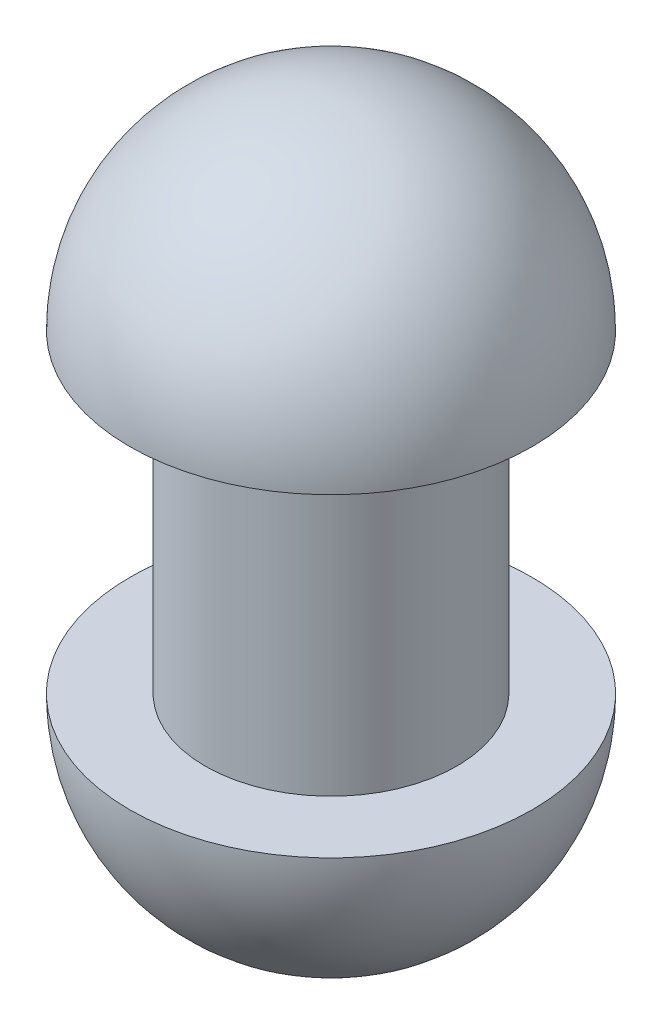
ISO-10303-21;
HEADER;
FILE_DESCRIPTION(('STEP AP214'),'2;1');
FILE_NAME('part.step','',(''),(''),'','','');
FILE_SCHEMA(('AUTOMOTIVE_DESIGN { 1 0 10303 214 1 1 1 1 }'));
ENDSEC;
DATA;
#1=APPLICATION_CONTEXT('core data for automotive mechanical design processes');
#2=APPLICATION_PROTOCOL_DEFINITION('international standard','automotive_design',2000,#1);
#3=PRODUCT_CONTEXT('',#1,'mechanical');
#4=PRODUCT('Part','Part','',(#3));
#5=PRODUCT_RELATED_PRODUCT_CATEGORY('part','',(#4));
#6=PRODUCT_DEFINITION_FORMATION('','',#4);
#7=PRODUCT_DEFINITION_CONTEXT('part definition',#1,'design');
#8=PRODUCT_DEFINITION('design','',#6,#7);
#9=PRODUCT_DEFINITION_SHAPE('','',#8);
#10=(LENGTH_UNIT() NAMED_UNIT(*) SI_UNIT(.MILLI.,.METRE.));
#11=(NAMED_UNIT(*) PLANE_ANGLE_UNIT() SI_UNIT($,.RADIAN.));
#12=(NAMED_UNIT(*) SI_UNIT($,.STERADIAN.) SOLID_ANGLE_UNIT());
#13=UNCERTAINTY_MEASURE_WITH_UNIT(LENGTH_MEASURE(1.E-05),#10,'distance_accuracy_value','');
#14=(GEOMETRIC_REPRESENTATION_CONTEXT(3) GLOBAL_UNCERTAINTY_ASSIGNED_CONTEXT((#13)) GLOBAL_UNIT_ASSIGNED_CONTEXT((#10,
#11,#12)) REPRESENTATION_CONTEXT('',''));
#15=CARTESIAN_POINT('',(0.,0.,0.));
#16=DIRECTION('',(0.,0.,1.));
#17=DIRECTION('',(1.,0.,0.));
#18=AXIS2_PLACEMENT_3D('',#15,#16,#17);
#19=CARTESIAN_POINT('',(8.99999999999999,-6.19109467455622,0.));
#20=DIRECTION('',(0.,1.,0.));
#21=DIRECTION('',(0.,0.,1.));
#22=AXIS2_PLACEMENT_3D('',#19,#20,#21);
#23=PLANE('',#22);
#24=CARTESIAN_POINT('',(0.,-6.19109467455621,0.));
#25=DIRECTION('',(0.,1.,0.));
#26=DIRECTION('',(0.,0.,1.));
#27=AXIS2_PLACEMENT_3D('',#24,#25,#26);
#28=CIRCLE('',#27,14.4);
#29=CARTESIAN_POINT('',(0.,-6.19109467455621,14.4));
#30=VERTEX_POINT('',#29);
#31=EDGE_CURVE('E10',#30,#30,#28,.T.);
#32=ORIENTED_EDGE('',*,*,#31,.F.);
#33=EDGE_LOOP('',(#32));
#34=FACE_BOUND('',#33,.T.);
#35=CARTESIAN_POINT('',(0.,-6.19109467455622,0.));
#36=DIRECTION('',(0.,1.,0.));
#37=DIRECTION('',(0.,0.,1.));
#38=AXIS2_PLACEMENT_3D('',#35,#36,#37);
#39=CIRCLE('',#38,8.99999999999999);
#40=CARTESIAN_POINT('',(0.,-6.19109467455622,8.99999999999999));
#41=VERTEX_POINT('',#40);
#42=EDGE_CURVE('E45',#41,#41,#39,.T.);
#43=ORIENTED_EDGE('',*,*,#42,.T.);
#44=EDGE_LOOP('',(#43));
#45=FACE_BOUND('',#44,.T.);
#46=ADVANCED_FACE('F31',(#34,#45),#23,.F.);
#47=CARTESIAN_POINT('',(0.,-6.19109467455621,0.));
#48=DIRECTION('',(0.,1.,0.));
#49=DIRECTION('',(1.,0.,0.));
#50=AXIS2_PLACEMENT_3D('',#47,#48,#49);
#51=SPHERICAL_SURFACE('',#50,14.4);
#52=ORIENTED_EDGE('',*,*,#31,.T.);
#53=EDGE_LOOP('',(#52));
#54=FACE_BOUND('',#53,.T.);
#55=ADVANCED_FACE('F65',(#54),#51,.T.);
#56=CARTESIAN_POINT('',(0.,-28.6910946745562,0.));
#57=DIRECTION('',(0.,1.,0.));
#58=DIRECTION('',(1.,0.,0.));
#59=AXIS2_PLACEMENT_3D('',#56,#57,#58);
#60=SPHERICAL_SURFACE('',#59,14.4);
#61=CARTESIAN_POINT('',(0.,-28.6910946745562,0.));
#62=DIRECTION('',(0.,1.,0.));
#63=DIRECTION('',(0.,0.,1.));
#64=AXIS2_PLACEMENT_3D('',#61,#62,#63);
#65=CIRCLE('',#64,14.4);
#66=CARTESIAN_POINT('',(0.,-28.6910946745562,14.4));
#67=VERTEX_POINT('',#66);
#68=EDGE_CURVE('E37',#67,#67,#65,.T.);
#69=ORIENTED_EDGE('',*,*,#68,.F.);
#70=EDGE_LOOP('',(#69));
#71=FACE_BOUND('',#70,.T.);
#72=ADVANCED_FACE('F60',(#71),#60,.T.);
#73=CARTESIAN_POINT('',(9.,-28.6910946745562,0.));
#74=DIRECTION('',(0.,-1.,0.));
#75=DIRECTION('',(0.,0.,-1.));
#76=AXIS2_PLACEMENT_3D('',#73,#74,#75);
#77=PLANE('',#76);
#78=CARTESIAN_POINT('',(0.,-28.6910946745562,0.));
#79=DIRECTION('',(0.,1.,0.));
#80=DIRECTION('',(0.,0.,1.));
#81=AXIS2_PLACEMENT_3D('',#78,#79,#80);
#82=CIRCLE('',#81,9.);
#83=CARTESIAN_POINT('',(0.,-28.6910946745562,9.));
#84=VERTEX_POINT('',#83);
#85=EDGE_CURVE('E41',#84,#84,#82,.T.);
#86=ORIENTED_EDGE('',*,*,#85,.F.);
#87=EDGE_LOOP('',(#86));
#88=FACE_BOUND('',#87,.T.);
#89=ORIENTED_EDGE('',*,*,#68,.T.);
#90=EDGE_LOOP('',(#89));
#91=FACE_BOUND('',#90,.T.);
#92=ADVANCED_FACE('F55',(#88,#91),#77,.F.);
#93=CARTESIAN_POINT('',(0.,0.,0.));
#94=DIRECTION('',(0.,1.,0.));
#95=DIRECTION('',(0.,0.,1.));
#96=AXIS2_PLACEMENT_3D('',#93,#94,#95);
#97=CYLINDRICAL_SURFACE('',#96,9.);
#98=ORIENTED_EDGE('',*,*,#42,.F.);
#99=EDGE_LOOP('',(#98));
#100=FACE_BOUND('',#99,.T.);
#101=ORIENTED_EDGE('',*,*,#85,.T.);
#102=EDGE_LOOP('',(#101));
#103=FACE_BOUND('',#102,.T.);
#104=ADVANCED_FACE('F52',(#100,#103),#97,.T.);
#105=CLOSED_SHELL('',(#46,#55,#72,#92,#104));
#106=MANIFOLD_SOLID_BREP('B2',#105);
#107=ADVANCED_BREP_SHAPE_REPRESENTATION('',(#18,#106),#14);
#108=SHAPE_DEFINITION_REPRESENTATION(#9,#107);
ENDSEC;
END-ISO-10303-21;
